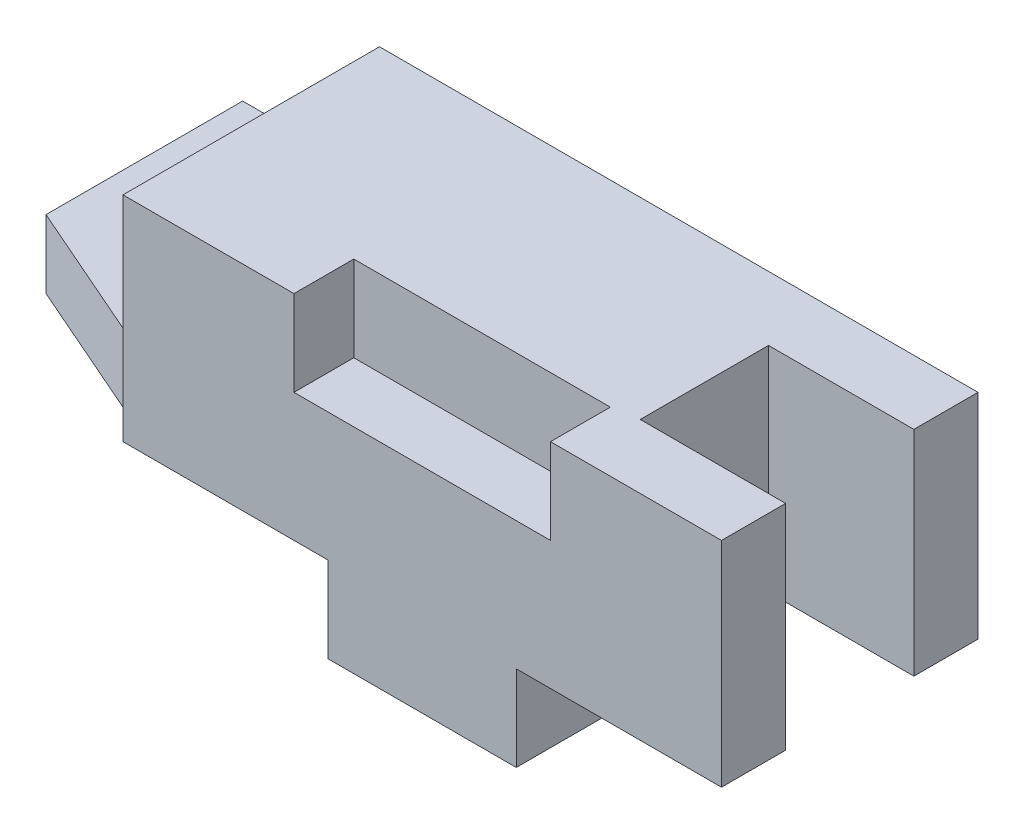
ISO-10303-21;
HEADER;
FILE_DESCRIPTION(('STEP AP214'),'2;1');
FILE_NAME('part.step','',(''),(''),'','','');
FILE_SCHEMA(('AUTOMOTIVE_DESIGN { 1 0 10303 214 1 1 1 1 }'));
ENDSEC;
DATA;
#1=APPLICATION_CONTEXT('core data for automotive mechanical design processes');
#2=APPLICATION_PROTOCOL_DEFINITION('international standard','automotive_design',2000,#1);
#3=PRODUCT_CONTEXT('',#1,'mechanical');
#4=PRODUCT('Part','Part','',(#3));
#5=PRODUCT_RELATED_PRODUCT_CATEGORY('part','',(#4));
#6=PRODUCT_DEFINITION_FORMATION('','',#4);
#7=PRODUCT_DEFINITION_CONTEXT('part definition',#1,'design');
#8=PRODUCT_DEFINITION('design','',#6,#7);
#9=PRODUCT_DEFINITION_SHAPE('','',#8);
#10=(LENGTH_UNIT() NAMED_UNIT(*) SI_UNIT(.MILLI.,.METRE.));
#11=(NAMED_UNIT(*) PLANE_ANGLE_UNIT() SI_UNIT($,.RADIAN.));
#12=(NAMED_UNIT(*) SI_UNIT($,.STERADIAN.) SOLID_ANGLE_UNIT());
#13=UNCERTAINTY_MEASURE_WITH_UNIT(LENGTH_MEASURE(1.E-05),#10,'distance_accuracy_value','');
#14=(GEOMETRIC_REPRESENTATION_CONTEXT(3) GLOBAL_UNCERTAINTY_ASSIGNED_CONTEXT((#13)) GLOBAL_UNIT_ASSIGNED_CONTEXT((#10,
#11,#12)) REPRESENTATION_CONTEXT('',''));
#15=CARTESIAN_POINT('',(0.,0.,0.));
#16=DIRECTION('',(0.,0.,1.));
#17=DIRECTION('',(1.,0.,0.));
#18=AXIS2_PLACEMENT_3D('',#15,#16,#17);
#19=CARTESIAN_POINT('',(0.,-7.5,30.));
#20=DIRECTION('',(0.,1.,0.));
#21=DIRECTION('',(0.,0.,1.));
#22=AXIS2_PLACEMENT_3D('',#19,#20,#21);
#23=PLANE('',#22);
#24=DIRECTION('',(1.,0.,0.));
#25=VECTOR('',#24,1.);
#26=CARTESIAN_POINT('',(0.,-7.5,7.5));
#27=LINE('',#26,#25);
#28=CARTESIAN_POINT('',(18.,-7.5,7.5));
#29=VERTEX_POINT('',#28);
#30=CARTESIAN_POINT('',(35.,-7.5,7.5));
#31=VERTEX_POINT('',#30);
#32=EDGE_CURVE('E233',#29,#31,#27,.T.);
#33=ORIENTED_EDGE('',*,*,#32,.F.);
#34=DIRECTION('',(0.,0.,1.));
#35=VECTOR('',#34,1.);
#36=CARTESIAN_POINT('',(18.,-7.5,30.));
#37=LINE('',#36,#35);
#38=CARTESIAN_POINT('',(18.,-7.5,22.5));
#39=VERTEX_POINT('',#38);
#40=EDGE_CURVE('E227',#29,#39,#37,.T.);
#41=ORIENTED_EDGE('',*,*,#40,.T.);
#42=DIRECTION('',(1.,0.,0.));
#43=VECTOR('',#42,1.);
#44=CARTESIAN_POINT('',(0.,-7.5,22.5));
#45=LINE('',#44,#43);
#46=CARTESIAN_POINT('',(35.,-7.5,22.5));
#47=VERTEX_POINT('',#46);
#48=EDGE_CURVE('E230',#39,#47,#45,.T.);
#49=ORIENTED_EDGE('',*,*,#48,.T.);
#50=DIRECTION('',(0.,0.,-1.));
#51=VECTOR('',#50,1.);
#52=CARTESIAN_POINT('',(35.,-7.5,30.));
#53=LINE('',#52,#51);
#54=CARTESIAN_POINT('',(35.,-7.5,30.));
#55=VERTEX_POINT('',#54);
#56=EDGE_CURVE('E304',#55,#47,#53,.T.);
#57=ORIENTED_EDGE('',*,*,#56,.F.);
#58=DIRECTION('',(1.,0.,0.));
#59=VECTOR('',#58,1.);
#60=CARTESIAN_POINT('',(0.,-7.5,30.));
#61=LINE('',#60,#59);
#62=CARTESIAN_POINT('',(11.,-7.5,30.));
#63=VERTEX_POINT('',#62);
#64=EDGE_CURVE('E241',#63,#55,#61,.T.);
#65=ORIENTED_EDGE('',*,*,#64,.F.);
#66=DIRECTION('',(0.,0.,-1.));
#67=VECTOR('',#66,1.);
#68=CARTESIAN_POINT('',(11.,-7.5,30.));
#69=LINE('',#68,#67);
#70=CARTESIAN_POINT('',(11.,-7.5,0.));
#71=VERTEX_POINT('',#70);
#72=EDGE_CURVE('E307',#63,#71,#69,.T.);
#73=ORIENTED_EDGE('',*,*,#72,.T.);
#74=DIRECTION('',(1.,0.,0.));
#75=VECTOR('',#74,1.);
#76=CARTESIAN_POINT('',(0.,-7.5,0.));
#77=LINE('',#76,#75);
#78=CARTESIAN_POINT('',(35.,-7.5,0.));
#79=VERTEX_POINT('',#78);
#80=EDGE_CURVE('E261',#71,#79,#77,.T.);
#81=ORIENTED_EDGE('',*,*,#80,.T.);
#82=EDGE_CURVE('E303',#31,#79,#53,.T.);
#83=ORIENTED_EDGE('',*,*,#82,.F.);
#84=EDGE_LOOP('',(#33,#41,#49,#57,#65,#73,#81,#83));
#85=FACE_BOUND('',#84,.T.);
#86=ADVANCED_FACE('F36',(#85),#23,.F.);
#87=CARTESIAN_POINT('',(35.,0.,30.));
#88=DIRECTION('',(-1.,0.,0.));
#89=DIRECTION('',(0.,0.,1.));
#90=AXIS2_PLACEMENT_3D('',#87,#88,#89);
#91=PLANE('',#90);
#92=DIRECTION('',(0.,1.,0.));
#93=VECTOR('',#92,1.);
#94=CARTESIAN_POINT('',(35.,-34.,7.5));
#95=LINE('',#94,#93);
#96=CARTESIAN_POINT('',(35.,17.5,7.5));
#97=VERTEX_POINT('',#96);
#98=EDGE_CURVE('E225',#31,#97,#95,.T.);
#99=ORIENTED_EDGE('',*,*,#98,.F.);
#100=ORIENTED_EDGE('',*,*,#82,.T.);
#101=DIRECTION('',(0.,1.,0.));
#102=VECTOR('',#101,1.);
#103=CARTESIAN_POINT('',(35.,0.,0.));
#104=LINE('',#103,#102);
#105=CARTESIAN_POINT('',(35.,17.5,0.));
#106=VERTEX_POINT('',#105);
#107=EDGE_CURVE('E269',#79,#106,#104,.T.);
#108=ORIENTED_EDGE('',*,*,#107,.T.);
#109=DIRECTION('',(0.,0.,-1.));
#110=VECTOR('',#109,1.);
#111=CARTESIAN_POINT('',(35.,17.5,30.));
#112=LINE('',#111,#110);
#113=EDGE_CURVE('E299',#97,#106,#112,.T.);
#114=ORIENTED_EDGE('',*,*,#113,.F.);
#115=EDGE_LOOP('',(#99,#100,#108,#114));
#116=FACE_BOUND('',#115,.T.);
#117=ADVANCED_FACE('F328',(#116),#91,.F.);
#118=CARTESIAN_POINT('',(0.,17.5,30.));
#119=DIRECTION('',(0.,1.,0.));
#120=DIRECTION('',(0.,0.,1.));
#121=AXIS2_PLACEMENT_3D('',#118,#119,#120);
#122=PLANE('',#121);
#123=DIRECTION('',(0.,0.,1.));
#124=VECTOR('',#123,1.);
#125=CARTESIAN_POINT('',(15.,17.5,23.));
#126=LINE('',#125,#124);
#127=CARTESIAN_POINT('',(15.,17.5,23.));
#128=VERTEX_POINT('',#127);
#129=CARTESIAN_POINT('',(15.,17.5,30.));
#130=VERTEX_POINT('',#129);
#131=EDGE_CURVE('E173',#128,#130,#126,.T.);
#132=ORIENTED_EDGE('',*,*,#131,.T.);
#133=DIRECTION('',(1.,0.,0.));
#134=VECTOR('',#133,1.);
#135=CARTESIAN_POINT('',(0.,17.5,30.));
#136=LINE('',#135,#134);
#137=CARTESIAN_POINT('',(35.,17.5,30.));
#138=VERTEX_POINT('',#137);
#139=EDGE_CURVE('E251',#130,#138,#136,.T.);
#140=ORIENTED_EDGE('',*,*,#139,.T.);
#141=CARTESIAN_POINT('',(35.,17.5,22.5));
#142=VERTEX_POINT('',#141);
#143=EDGE_CURVE('E300',#138,#142,#112,.T.);
#144=ORIENTED_EDGE('',*,*,#143,.T.);
#145=DIRECTION('',(1.,0.,0.));
#146=VECTOR('',#145,1.);
#147=CARTESIAN_POINT('',(0.,17.5,22.5));
#148=LINE('',#147,#146);
#149=CARTESIAN_POINT('',(18.,17.5,22.5));
#150=VERTEX_POINT('',#149);
#151=EDGE_CURVE('E319',#150,#142,#148,.T.);
#152=ORIENTED_EDGE('',*,*,#151,.F.);
#153=DIRECTION('',(0.,0.,1.));
#154=VECTOR('',#153,1.);
#155=CARTESIAN_POINT('',(18.,17.5,30.));
#156=LINE('',#155,#154);
#157=CARTESIAN_POINT('',(18.,17.5,7.5));
#158=VERTEX_POINT('',#157);
#159=EDGE_CURVE('E317',#158,#150,#156,.T.);
#160=ORIENTED_EDGE('',*,*,#159,.F.);
#161=DIRECTION('',(1.,0.,0.));
#162=VECTOR('',#161,1.);
#163=CARTESIAN_POINT('',(0.,17.5,7.5));
#164=LINE('',#163,#162);
#165=EDGE_CURVE('E44',#158,#97,#164,.T.);
#166=ORIENTED_EDGE('',*,*,#165,.T.);
#167=ORIENTED_EDGE('',*,*,#113,.T.);
#168=DIRECTION('',(1.,0.,0.));
#169=VECTOR('',#168,1.);
#170=CARTESIAN_POINT('',(0.,17.5,0.));
#171=LINE('',#170,#169);
#172=CARTESIAN_POINT('',(-35.,17.5,0.));
#173=VERTEX_POINT('',#172);
#174=EDGE_CURVE('E272',#173,#106,#171,.T.);
#175=ORIENTED_EDGE('',*,*,#174,.F.);
#176=DIRECTION('',(0.,0.,-1.));
#177=VECTOR('',#176,1.);
#178=CARTESIAN_POINT('',(-35.,17.5,30.));
#179=LINE('',#178,#177);
#180=CARTESIAN_POINT('',(-35.,17.5,30.));
#181=VERTEX_POINT('',#180);
#182=EDGE_CURVE('E297',#181,#173,#179,.T.);
#183=ORIENTED_EDGE('',*,*,#182,.F.);
#184=CARTESIAN_POINT('',(-15.,17.5,30.));
#185=VERTEX_POINT('',#184);
#186=EDGE_CURVE('E252',#181,#185,#136,.T.);
#187=ORIENTED_EDGE('',*,*,#186,.T.);
#188=DIRECTION('',(0.,0.,1.));
#189=VECTOR('',#188,1.);
#190=CARTESIAN_POINT('',(-15.,17.5,23.));
#191=LINE('',#190,#189);
#192=CARTESIAN_POINT('',(-15.,17.5,23.));
#193=VERTEX_POINT('',#192);
#194=EDGE_CURVE('E51',#193,#185,#191,.T.);
#195=ORIENTED_EDGE('',*,*,#194,.F.);
#196=DIRECTION('',(-1.,0.,0.));
#197=VECTOR('',#196,1.);
#198=CARTESIAN_POINT('',(-15.,17.5,23.));
#199=LINE('',#198,#197);
#200=EDGE_CURVE('E189',#128,#193,#199,.T.);
#201=ORIENTED_EDGE('',*,*,#200,.F.);
#202=EDGE_LOOP('',(#132,#140,#144,#152,#160,#166,#167,#175,#183,#187,#195,#201));
#203=FACE_BOUND('',#202,.T.);
#204=ADVANCED_FACE('F193',(#203),#122,.T.);
#205=CARTESIAN_POINT('',(-35.,-7.5,0.));
#206=VERTEX_POINT('',#205);
#207=CARTESIAN_POINT('',(-11.,-7.5,0.));
#208=VERTEX_POINT('',#207);
#209=EDGE_CURVE('E235',#206,#208,#77,.T.);
#210=ORIENTED_EDGE('',*,*,#209,.T.);
#211=DIRECTION('',(0.,0.,-1.));
#212=VECTOR('',#211,1.);
#213=CARTESIAN_POINT('',(-11.,-7.5,30.));
#214=LINE('',#213,#212);
#215=CARTESIAN_POINT('',(-11.,-7.5,30.));
#216=VERTEX_POINT('',#215);
#217=EDGE_CURVE('E314',#216,#208,#214,.T.);
#218=ORIENTED_EDGE('',*,*,#217,.F.);
#219=CARTESIAN_POINT('',(-35.,-7.5,30.));
#220=VERTEX_POINT('',#219);
#221=EDGE_CURVE('E236',#220,#216,#61,.T.);
#222=ORIENTED_EDGE('',*,*,#221,.F.);
#223=DIRECTION('',(0.,0.,-1.));
#224=VECTOR('',#223,1.);
#225=CARTESIAN_POINT('',(-35.,-7.5,30.));
#226=LINE('',#225,#224);
#227=EDGE_CURVE('E287',#220,#206,#226,.T.);
#228=ORIENTED_EDGE('',*,*,#227,.T.);
#229=EDGE_LOOP('',(#210,#218,#222,#228));
#230=FACE_BOUND('',#229,.T.);
#231=ADVANCED_FACE('F371',(#230),#23,.F.);
#232=CARTESIAN_POINT('',(-11.,0.,30.));
#233=DIRECTION('',(1.,0.,0.));
#234=DIRECTION('',(0.,1.,0.));
#235=AXIS2_PLACEMENT_3D('',#232,#233,#234);
#236=PLANE('',#235);
#237=DIRECTION('',(0.,-1.,0.));
#238=VECTOR('',#237,1.);
#239=CARTESIAN_POINT('',(-11.,0.,0.));
#240=LINE('',#239,#238);
#241=CARTESIAN_POINT('',(-11.,-17.5,0.));
#242=VERTEX_POINT('',#241);
#243=EDGE_CURVE('E260',#208,#242,#240,.T.);
#244=ORIENTED_EDGE('',*,*,#243,.T.);
#245=DIRECTION('',(0.,0.,-1.));
#246=VECTOR('',#245,1.);
#247=CARTESIAN_POINT('',(-11.,-17.5,30.));
#248=LINE('',#247,#246);
#249=CARTESIAN_POINT('',(-11.,-17.5,30.));
#250=VERTEX_POINT('',#249);
#251=EDGE_CURVE('E311',#250,#242,#248,.T.);
#252=ORIENTED_EDGE('',*,*,#251,.F.);
#253=DIRECTION('',(0.,-1.,0.));
#254=VECTOR('',#253,1.);
#255=CARTESIAN_POINT('',(-11.,0.,30.));
#256=LINE('',#255,#254);
#257=EDGE_CURVE('E239',#216,#250,#256,.T.);
#258=ORIENTED_EDGE('',*,*,#257,.F.);
#259=ORIENTED_EDGE('',*,*,#217,.T.);
#260=EDGE_LOOP('',(#244,#252,#258,#259));
#261=FACE_BOUND('',#260,.T.);
#262=ADVANCED_FACE('F38',(#261),#236,.F.);
#263=CARTESIAN_POINT('',(0.,-17.5,30.));
#264=DIRECTION('',(0.,1.,0.));
#265=DIRECTION('',(0.,0.,1.));
#266=AXIS2_PLACEMENT_3D('',#263,#264,#265);
#267=PLANE('',#266);
#268=DIRECTION('',(1.,0.,0.));
#269=VECTOR('',#268,1.);
#270=CARTESIAN_POINT('',(0.,-17.5,0.));
#271=LINE('',#270,#269);
#272=CARTESIAN_POINT('',(11.,-17.5,0.));
#273=VERTEX_POINT('',#272);
#274=EDGE_CURVE('E263',#242,#273,#271,.T.);
#275=ORIENTED_EDGE('',*,*,#274,.T.);
#276=DIRECTION('',(0.,0.,-1.));
#277=VECTOR('',#276,1.);
#278=CARTESIAN_POINT('',(11.,-17.5,30.));
#279=LINE('',#278,#277);
#280=CARTESIAN_POINT('',(11.,-17.5,30.));
#281=VERTEX_POINT('',#280);
#282=EDGE_CURVE('E309',#281,#273,#279,.T.);
#283=ORIENTED_EDGE('',*,*,#282,.F.);
#284=DIRECTION('',(1.,0.,0.));
#285=VECTOR('',#284,1.);
#286=CARTESIAN_POINT('',(0.,-17.5,30.));
#287=LINE('',#286,#285);
#288=EDGE_CURVE('E243',#250,#281,#287,.T.);
#289=ORIENTED_EDGE('',*,*,#288,.F.);
#290=ORIENTED_EDGE('',*,*,#251,.T.);
#291=EDGE_LOOP('',(#275,#283,#289,#290));
#292=FACE_BOUND('',#291,.T.);
#293=ADVANCED_FACE('F377',(#292),#267,.F.);
#294=CARTESIAN_POINT('',(11.,0.,30.));
#295=DIRECTION('',(1.,0.,0.));
#296=DIRECTION('',(0.,1.,0.));
#297=AXIS2_PLACEMENT_3D('',#294,#295,#296);
#298=PLANE('',#297);
#299=DIRECTION('',(0.,-1.,0.));
#300=VECTOR('',#299,1.);
#301=CARTESIAN_POINT('',(11.,0.,0.));
#302=LINE('',#301,#300);
#303=EDGE_CURVE('E266',#71,#273,#302,.T.);
#304=ORIENTED_EDGE('',*,*,#303,.F.);
#305=ORIENTED_EDGE('',*,*,#72,.F.);
#306=DIRECTION('',(0.,-1.,0.));
#307=VECTOR('',#306,1.);
#308=CARTESIAN_POINT('',(11.,0.,30.));
#309=LINE('',#308,#307);
#310=EDGE_CURVE('E245',#63,#281,#309,.T.);
#311=ORIENTED_EDGE('',*,*,#310,.T.);
#312=ORIENTED_EDGE('',*,*,#282,.T.);
#313=EDGE_LOOP('',(#304,#305,#311,#312));
#314=FACE_BOUND('',#313,.T.);
#315=ADVANCED_FACE('F383',(#314),#298,.T.);
#316=ORIENTED_EDGE('',*,*,#56,.T.);
#317=DIRECTION('',(0.,1.,0.));
#318=VECTOR('',#317,1.);
#319=CARTESIAN_POINT('',(35.,-34.,22.5));
#320=LINE('',#319,#318);
#321=EDGE_CURVE('E222',#47,#142,#320,.T.);
#322=ORIENTED_EDGE('',*,*,#321,.T.);
#323=ORIENTED_EDGE('',*,*,#143,.F.);
#324=DIRECTION('',(0.,1.,0.));
#325=VECTOR('',#324,1.);
#326=CARTESIAN_POINT('',(35.,0.,30.));
#327=LINE('',#326,#325);
#328=EDGE_CURVE('E248',#55,#138,#327,.T.);
#329=ORIENTED_EDGE('',*,*,#328,.F.);
#330=EDGE_LOOP('',(#316,#322,#323,#329));
#331=FACE_BOUND('',#330,.T.);
#332=ADVANCED_FACE('F389',(#331),#91,.F.);
#333=CARTESIAN_POINT('',(-35.,0.,30.));
#334=DIRECTION('',(-1.,0.,0.));
#335=DIRECTION('',(0.,0.,1.));
#336=AXIS2_PLACEMENT_3D('',#333,#334,#335);
#337=PLANE('',#336);
#338=DIRECTION('',(0.,1.,0.));
#339=VECTOR('',#338,1.);
#340=CARTESIAN_POINT('',(-35.,0.,0.));
#341=LINE('',#340,#339);
#342=CARTESIAN_POINT('',(-35.,4.,0.));
#343=VERTEX_POINT('',#342);
#344=EDGE_CURVE('E275',#343,#173,#341,.T.);
#345=ORIENTED_EDGE('',*,*,#344,.F.);
#346=DIRECTION('',(0.,0.,-1.));
#347=VECTOR('',#346,1.);
#348=CARTESIAN_POINT('',(-35.,4.,30.));
#349=LINE('',#348,#347);
#350=CARTESIAN_POINT('',(-35.,4.,30.));
#351=VERTEX_POINT('',#350);
#352=EDGE_CURVE('E295',#351,#343,#349,.T.);
#353=ORIENTED_EDGE('',*,*,#352,.F.);
#354=DIRECTION('',(0.,1.,0.));
#355=VECTOR('',#354,1.);
#356=CARTESIAN_POINT('',(-35.,0.,30.));
#357=LINE('',#356,#355);
#358=EDGE_CURVE('E254',#351,#181,#357,.T.);
#359=ORIENTED_EDGE('',*,*,#358,.T.);
#360=ORIENTED_EDGE('',*,*,#182,.T.);
#361=EDGE_LOOP('',(#345,#353,#359,#360));
#362=FACE_BOUND('',#361,.T.);
#363=ADVANCED_FACE('F345',(#362),#337,.T.);
#364=CARTESIAN_POINT('',(0.,4.,30.));
#365=DIRECTION('',(0.,1.,0.));
#366=DIRECTION('',(0.,0.,1.));
#367=AXIS2_PLACEMENT_3D('',#364,#365,#366);
#368=PLANE('',#367);
#369=DIRECTION('',(-0.916157334902189,0.,-0.400818834019708));
#370=VECTOR('',#369,1.);
#371=CARTESIAN_POINT('',(-5.62295081967213,4.,42.8524590163934));
#372=LINE('',#371,#370);
#373=CARTESIAN_POINT('',(-51.,4.,23.));
#374=VERTEX_POINT('',#373);
#375=EDGE_CURVE('E216',#351,#374,#372,.T.);
#376=ORIENTED_EDGE('',*,*,#375,.F.);
#377=ORIENTED_EDGE('',*,*,#352,.T.);
#378=DIRECTION('',(1.,0.,0.));
#379=VECTOR('',#378,1.);
#380=CARTESIAN_POINT('',(0.,4.,0.));
#381=LINE('',#380,#379);
#382=CARTESIAN_POINT('',(-51.,4.,0.));
#383=VERTEX_POINT('',#382);
#384=EDGE_CURVE('E278',#383,#343,#381,.T.);
#385=ORIENTED_EDGE('',*,*,#384,.F.);
#386=DIRECTION('',(0.,0.,-1.));
#387=VECTOR('',#386,1.);
#388=CARTESIAN_POINT('',(-51.,4.,30.));
#389=LINE('',#388,#387);
#390=EDGE_CURVE('E293',#374,#383,#389,.T.);
#391=ORIENTED_EDGE('',*,*,#390,.F.);
#392=EDGE_LOOP('',(#376,#377,#385,#391));
#393=FACE_BOUND('',#392,.T.);
#394=ADVANCED_FACE('F349',(#393),#368,.T.);
#395=CARTESIAN_POINT('',(-51.,0.,30.));
#396=DIRECTION('',(-1.,0.,0.));
#397=DIRECTION('',(0.,0.,1.));
#398=AXIS2_PLACEMENT_3D('',#395,#396,#397);
#399=PLANE('',#398);
#400=DIRECTION('',(0.,1.,0.));
#401=VECTOR('',#400,1.);
#402=CARTESIAN_POINT('',(-51.,-34.,23.));
#403=LINE('',#402,#401);
#404=CARTESIAN_POINT('',(-51.,-4.,23.));
#405=VERTEX_POINT('',#404);
#406=EDGE_CURVE('E207',#405,#374,#403,.T.);
#407=ORIENTED_EDGE('',*,*,#406,.T.);
#408=ORIENTED_EDGE('',*,*,#390,.T.);
#409=DIRECTION('',(0.,1.,0.));
#410=VECTOR('',#409,1.);
#411=CARTESIAN_POINT('',(-51.,0.,0.));
#412=LINE('',#411,#410);
#413=CARTESIAN_POINT('',(-51.,-4.,0.));
#414=VERTEX_POINT('',#413);
#415=EDGE_CURVE('E281',#414,#383,#412,.T.);
#416=ORIENTED_EDGE('',*,*,#415,.F.);
#417=DIRECTION('',(0.,0.,-1.));
#418=VECTOR('',#417,1.);
#419=CARTESIAN_POINT('',(-51.,-4.,30.));
#420=LINE('',#419,#418);
#421=EDGE_CURVE('E291',#405,#414,#420,.T.);
#422=ORIENTED_EDGE('',*,*,#421,.F.);
#423=EDGE_LOOP('',(#407,#408,#416,#422));
#424=FACE_BOUND('',#423,.T.);
#425=ADVANCED_FACE('F355',(#424),#399,.T.);
#426=CARTESIAN_POINT('',(0.,-4.,30.));
#427=DIRECTION('',(0.,1.,0.));
#428=DIRECTION('',(0.,0.,1.));
#429=AXIS2_PLACEMENT_3D('',#426,#427,#428);
#430=PLANE('',#429);
#431=DIRECTION('',(0.,0.,-1.));
#432=VECTOR('',#431,1.);
#433=CARTESIAN_POINT('',(-35.,-4.,30.));
#434=LINE('',#433,#432);
#435=CARTESIAN_POINT('',(-35.,-4.,30.));
#436=VERTEX_POINT('',#435);
#437=CARTESIAN_POINT('',(-35.,-4.,0.));
#438=VERTEX_POINT('',#437);
#439=EDGE_CURVE('E289',#436,#438,#434,.T.);
#440=ORIENTED_EDGE('',*,*,#439,.F.);
#441=DIRECTION('',(-0.916157334902189,0.,-0.400818834019708));
#442=VECTOR('',#441,1.);
#443=CARTESIAN_POINT('',(-5.62295081967213,-4.,42.8524590163934));
#444=LINE('',#443,#442);
#445=EDGE_CURVE('E213',#436,#405,#444,.T.);
#446=ORIENTED_EDGE('',*,*,#445,.T.);
#447=ORIENTED_EDGE('',*,*,#421,.T.);
#448=DIRECTION('',(1.,0.,0.));
#449=VECTOR('',#448,1.);
#450=CARTESIAN_POINT('',(0.,-4.,0.));
#451=LINE('',#450,#449);
#452=EDGE_CURVE('E284',#414,#438,#451,.T.);
#453=ORIENTED_EDGE('',*,*,#452,.T.);
#454=EDGE_LOOP('',(#440,#446,#447,#453));
#455=FACE_BOUND('',#454,.T.);
#456=ADVANCED_FACE('F360',(#455),#430,.F.);
#457=EDGE_CURVE('E240',#206,#438,#341,.T.);
#458=ORIENTED_EDGE('',*,*,#457,.F.);
#459=ORIENTED_EDGE('',*,*,#227,.F.);
#460=EDGE_CURVE('E257',#220,#436,#357,.T.);
#461=ORIENTED_EDGE('',*,*,#460,.T.);
#462=ORIENTED_EDGE('',*,*,#439,.T.);
#463=EDGE_LOOP('',(#458,#459,#461,#462));
#464=FACE_BOUND('',#463,.T.);
#465=ADVANCED_FACE('F364',(#464),#337,.T.);
#466=CARTESIAN_POINT('',(0.,0.,30.));
#467=DIRECTION('',(0.,0.,1.));
#468=DIRECTION('',(1.,0.,0.));
#469=AXIS2_PLACEMENT_3D('',#466,#467,#468);
#470=PLANE('',#469);
#471=DIRECTION('',(0.,1.,0.));
#472=VECTOR('',#471,1.);
#473=CARTESIAN_POINT('',(15.,7.5,30.));
#474=LINE('',#473,#472);
#475=CARTESIAN_POINT('',(15.,7.5,30.));
#476=VERTEX_POINT('',#475);
#477=EDGE_CURVE('E179',#476,#130,#474,.T.);
#478=ORIENTED_EDGE('',*,*,#477,.F.);
#479=DIRECTION('',(1.,0.,0.));
#480=VECTOR('',#479,1.);
#481=CARTESIAN_POINT('',(-15.,7.5,30.));
#482=LINE('',#481,#480);
#483=CARTESIAN_POINT('',(-15.,7.5,30.));
#484=VERTEX_POINT('',#483);
#485=EDGE_CURVE('E191',#484,#476,#482,.T.);
#486=ORIENTED_EDGE('',*,*,#485,.F.);
#487=DIRECTION('',(0.,-1.,0.));
#488=VECTOR('',#487,1.);
#489=CARTESIAN_POINT('',(-15.,7.5,30.));
#490=LINE('',#489,#488);
#491=EDGE_CURVE('E201',#185,#484,#490,.T.);
#492=ORIENTED_EDGE('',*,*,#491,.F.);
#493=ORIENTED_EDGE('',*,*,#186,.F.);
#494=ORIENTED_EDGE('',*,*,#358,.F.);
#495=DIRECTION('',(0.,1.,0.));
#496=VECTOR('',#495,1.);
#497=CARTESIAN_POINT('',(-35.,0.,30.));
#498=LINE('',#497,#496);
#499=EDGE_CURVE('E11',#436,#351,#498,.T.);
#500=ORIENTED_EDGE('',*,*,#499,.F.);
#501=ORIENTED_EDGE('',*,*,#460,.F.);
#502=ORIENTED_EDGE('',*,*,#221,.T.);
#503=ORIENTED_EDGE('',*,*,#257,.T.);
#504=ORIENTED_EDGE('',*,*,#288,.T.);
#505=ORIENTED_EDGE('',*,*,#310,.F.);
#506=ORIENTED_EDGE('',*,*,#64,.T.);
#507=ORIENTED_EDGE('',*,*,#328,.T.);
#508=ORIENTED_EDGE('',*,*,#139,.F.);
#509=EDGE_LOOP('',(#478,#486,#492,#493,#494,#500,#501,#502,#503,#504,#505,#506,#507,#508));
#510=FACE_BOUND('',#509,.T.);
#511=ADVANCED_FACE('F341',(#510),#470,.T.);
#512=CARTESIAN_POINT('',(0.,0.,0.));
#513=DIRECTION('',(0.,0.,1.));
#514=DIRECTION('',(1.,0.,0.));
#515=AXIS2_PLACEMENT_3D('',#512,#513,#514);
#516=PLANE('',#515);
#517=ORIENTED_EDGE('',*,*,#209,.F.);
#518=ORIENTED_EDGE('',*,*,#457,.T.);
#519=ORIENTED_EDGE('',*,*,#452,.F.);
#520=ORIENTED_EDGE('',*,*,#415,.T.);
#521=ORIENTED_EDGE('',*,*,#384,.T.);
#522=ORIENTED_EDGE('',*,*,#344,.T.);
#523=ORIENTED_EDGE('',*,*,#174,.T.);
#524=ORIENTED_EDGE('',*,*,#107,.F.);
#525=ORIENTED_EDGE('',*,*,#80,.F.);
#526=ORIENTED_EDGE('',*,*,#303,.T.);
#527=ORIENTED_EDGE('',*,*,#274,.F.);
#528=ORIENTED_EDGE('',*,*,#243,.F.);
#529=EDGE_LOOP('',(#517,#518,#519,#520,#521,#522,#523,#524,#525,#526,#527,#528));
#530=FACE_BOUND('',#529,.T.);
#531=ADVANCED_FACE('F335',(#530),#516,.F.);
#532=CARTESIAN_POINT('',(0.,-34.,7.5));
#533=DIRECTION('',(0.,0.,1.));
#534=DIRECTION('',(1.,0.,0.));
#535=AXIS2_PLACEMENT_3D('',#532,#533,#534);
#536=PLANE('',#535);
#537=ORIENTED_EDGE('',*,*,#32,.T.);
#538=ORIENTED_EDGE('',*,*,#98,.T.);
#539=ORIENTED_EDGE('',*,*,#165,.F.);
#540=DIRECTION('',(0.,1.,0.));
#541=VECTOR('',#540,1.);
#542=CARTESIAN_POINT('',(18.,-34.,7.5));
#543=LINE('',#542,#541);
#544=EDGE_CURVE('E59',#29,#158,#543,.T.);
#545=ORIENTED_EDGE('',*,*,#544,.F.);
#546=EDGE_LOOP('',(#537,#538,#539,#545));
#547=FACE_BOUND('',#546,.T.);
#548=ADVANCED_FACE('F394',(#547),#536,.T.);
#549=CARTESIAN_POINT('',(0.,-34.,22.5));
#550=DIRECTION('',(0.,0.,1.));
#551=DIRECTION('',(1.,0.,0.));
#552=AXIS2_PLACEMENT_3D('',#549,#550,#551);
#553=PLANE('',#552);
#554=DIRECTION('',(0.,1.,0.));
#555=VECTOR('',#554,1.);
#556=CARTESIAN_POINT('',(18.,-34.,22.5));
#557=LINE('',#556,#555);
#558=EDGE_CURVE('E219',#39,#150,#557,.T.);
#559=ORIENTED_EDGE('',*,*,#558,.T.);
#560=ORIENTED_EDGE('',*,*,#151,.T.);
#561=ORIENTED_EDGE('',*,*,#321,.F.);
#562=ORIENTED_EDGE('',*,*,#48,.F.);
#563=EDGE_LOOP('',(#559,#560,#561,#562));
#564=FACE_BOUND('',#563,.T.);
#565=ADVANCED_FACE('F391',(#564),#553,.F.);
#566=CARTESIAN_POINT('',(18.,-34.,0.));
#567=DIRECTION('',(-1.,0.,0.));
#568=DIRECTION('',(0.,0.,1.));
#569=AXIS2_PLACEMENT_3D('',#566,#567,#568);
#570=PLANE('',#569);
#571=ORIENTED_EDGE('',*,*,#544,.T.);
#572=ORIENTED_EDGE('',*,*,#159,.T.);
#573=ORIENTED_EDGE('',*,*,#558,.F.);
#574=ORIENTED_EDGE('',*,*,#40,.F.);
#575=EDGE_LOOP('',(#571,#572,#573,#574));
#576=FACE_BOUND('',#575,.T.);
#577=ADVANCED_FACE('F393',(#576),#570,.F.);
#578=CARTESIAN_POINT('',(-16.6393442622951,-34.,38.0327868852459));
#579=DIRECTION('',(0.400818834019708,0.,-0.916157334902189));
#580=DIRECTION('',(-0.916157334902189,0.,-0.400818834019708));
#581=AXIS2_PLACEMENT_3D('',#578,#579,#580);
#582=PLANE('',#581);
#583=ORIENTED_EDGE('',*,*,#375,.T.);
#584=ORIENTED_EDGE('',*,*,#406,.F.);
#585=ORIENTED_EDGE('',*,*,#445,.F.);
#586=ORIENTED_EDGE('',*,*,#499,.T.);
#587=EDGE_LOOP('',(#583,#584,#585,#586));
#588=FACE_BOUND('',#587,.T.);
#589=ADVANCED_FACE('F352',(#588),#582,.F.);
#590=CARTESIAN_POINT('',(15.,7.5,23.));
#591=DIRECTION('',(1.,0.,0.));
#592=DIRECTION('',(0.,0.,-1.));
#593=AXIS2_PLACEMENT_3D('',#590,#591,#592);
#594=PLANE('',#593);
#595=ORIENTED_EDGE('',*,*,#477,.T.);
#596=ORIENTED_EDGE('',*,*,#131,.F.);
#597=DIRECTION('',(0.,1.,0.));
#598=VECTOR('',#597,1.);
#599=CARTESIAN_POINT('',(15.,7.5,23.));
#600=LINE('',#599,#598);
#601=CARTESIAN_POINT('',(15.,7.5,23.));
#602=VERTEX_POINT('',#601);
#603=EDGE_CURVE('E176',#602,#128,#600,.T.);
#604=ORIENTED_EDGE('',*,*,#603,.F.);
#605=DIRECTION('',(0.,0.,1.));
#606=VECTOR('',#605,1.);
#607=CARTESIAN_POINT('',(15.,7.5,23.));
#608=LINE('',#607,#606);
#609=EDGE_CURVE('E205',#602,#476,#608,.T.);
#610=ORIENTED_EDGE('',*,*,#609,.T.);
#611=EDGE_LOOP('',(#595,#596,#604,#610));
#612=FACE_BOUND('',#611,.T.);
#613=ADVANCED_FACE('F175',(#612),#594,.F.);
#614=CARTESIAN_POINT('',(-15.,7.5,23.));
#615=DIRECTION('',(0.,-1.,0.));
#616=DIRECTION('',(0.,0.,-1.));
#617=AXIS2_PLACEMENT_3D('',#614,#615,#616);
#618=PLANE('',#617);
#619=ORIENTED_EDGE('',*,*,#485,.T.);
#620=ORIENTED_EDGE('',*,*,#609,.F.);
#621=DIRECTION('',(1.,0.,0.));
#622=VECTOR('',#621,1.);
#623=CARTESIAN_POINT('',(-15.,7.5,23.));
#624=LINE('',#623,#622);
#625=CARTESIAN_POINT('',(-15.,7.5,23.));
#626=VERTEX_POINT('',#625);
#627=EDGE_CURVE('E183',#626,#602,#624,.T.);
#628=ORIENTED_EDGE('',*,*,#627,.F.);
#629=DIRECTION('',(0.,0.,1.));
#630=VECTOR('',#629,1.);
#631=CARTESIAN_POINT('',(-15.,7.5,23.));
#632=LINE('',#631,#630);
#633=EDGE_CURVE('E208',#626,#484,#632,.T.);
#634=ORIENTED_EDGE('',*,*,#633,.T.);
#635=EDGE_LOOP('',(#619,#620,#628,#634));
#636=FACE_BOUND('',#635,.T.);
#637=ADVANCED_FACE('F570',(#636),#618,.F.);
#638=CARTESIAN_POINT('',(-15.,7.5,23.));
#639=DIRECTION('',(-1.,0.,0.));
#640=DIRECTION('',(0.,0.,1.));
#641=AXIS2_PLACEMENT_3D('',#638,#639,#640);
#642=PLANE('',#641);
#643=ORIENTED_EDGE('',*,*,#491,.T.);
#644=ORIENTED_EDGE('',*,*,#633,.F.);
#645=DIRECTION('',(0.,-1.,0.));
#646=VECTOR('',#645,1.);
#647=CARTESIAN_POINT('',(-15.,7.5,23.));
#648=LINE('',#647,#646);
#649=EDGE_CURVE('E195',#193,#626,#648,.T.);
#650=ORIENTED_EDGE('',*,*,#649,.F.);
#651=ORIENTED_EDGE('',*,*,#194,.T.);
#652=EDGE_LOOP('',(#643,#644,#650,#651));
#653=FACE_BOUND('',#652,.T.);
#654=ADVANCED_FACE('F578',(#653),#642,.F.);
#655=CARTESIAN_POINT('',(0.,0.,23.));
#656=DIRECTION('',(0.,0.,-1.));
#657=DIRECTION('',(-1.,0.,0.));
#658=AXIS2_PLACEMENT_3D('',#655,#656,#657);
#659=PLANE('',#658);
#660=ORIENTED_EDGE('',*,*,#603,.T.);
#661=ORIENTED_EDGE('',*,*,#200,.T.);
#662=ORIENTED_EDGE('',*,*,#649,.T.);
#663=ORIENTED_EDGE('',*,*,#627,.T.);
#664=EDGE_LOOP('',(#660,#661,#662,#663));
#665=FACE_BOUND('',#664,.T.);
#666=ADVANCED_FACE('F187',(#665),#659,.F.);
#667=CLOSED_SHELL('',(#86,#117,#204,#231,#262,#293,#315,#332,#363,#394,#425,#456,#465,#511,#531,
#548,#565,#577,#589,#613,#637,#654,#666));
#668=MANIFOLD_SOLID_BREP('B2',#667);
#669=ADVANCED_BREP_SHAPE_REPRESENTATION('',(#18,#668),#14);
#670=SHAPE_DEFINITION_REPRESENTATION(#9,#669);
ENDSEC;
END-ISO-10303-21;
